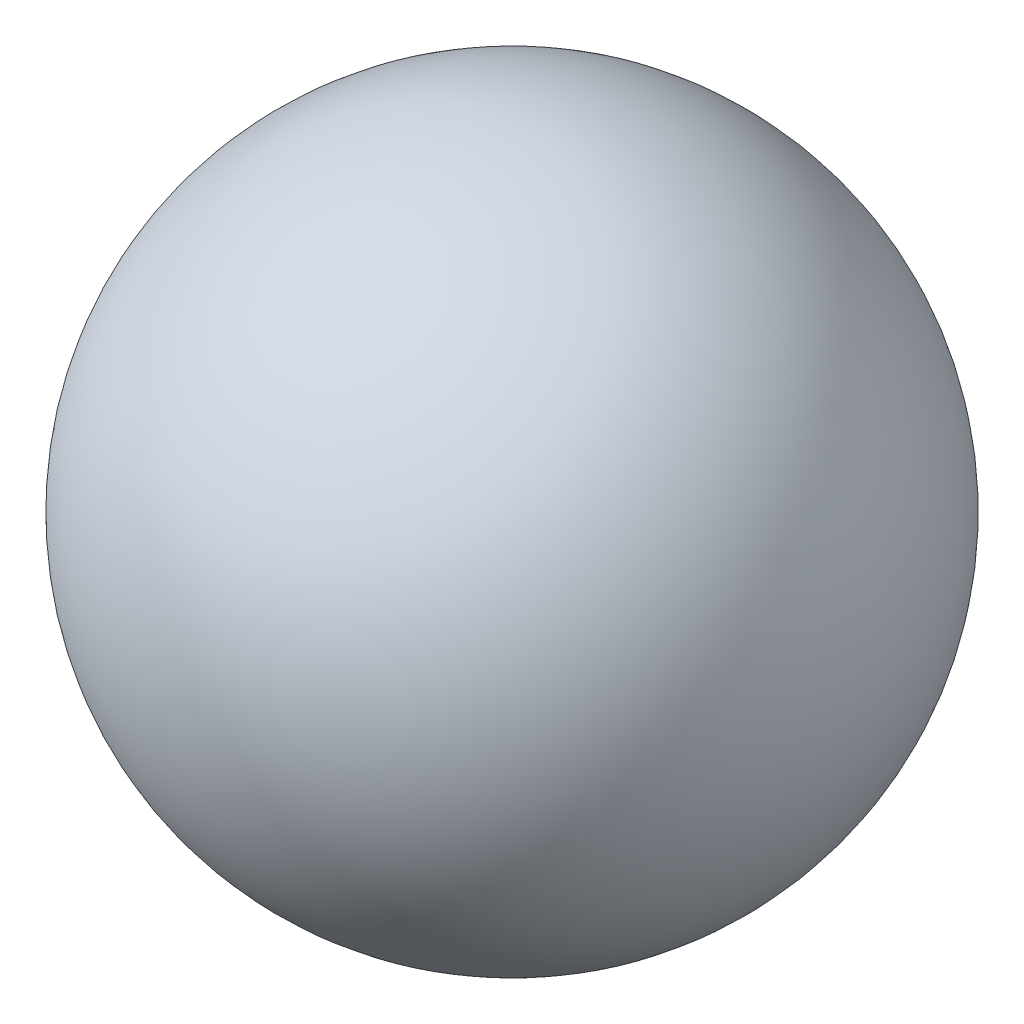
ISO-10303-21;
HEADER;
FILE_DESCRIPTION(('STEP AP214'),'2;1');
FILE_NAME('part.step','',(''),(''),'','','');
FILE_SCHEMA(('AUTOMOTIVE_DESIGN { 1 0 10303 214 1 1 1 1 }'));
ENDSEC;
DATA;
#1=APPLICATION_CONTEXT('core data for automotive mechanical design processes');
#2=APPLICATION_PROTOCOL_DEFINITION('international standard','automotive_design',2000,#1);
#3=PRODUCT_CONTEXT('',#1,'mechanical');
#4=PRODUCT('Part','Part','',(#3));
#5=PRODUCT_RELATED_PRODUCT_CATEGORY('part','',(#4));
#6=PRODUCT_DEFINITION_FORMATION('','',#4);
#7=PRODUCT_DEFINITION_CONTEXT('part definition',#1,'design');
#8=PRODUCT_DEFINITION('design','',#6,#7);
#9=PRODUCT_DEFINITION_SHAPE('','',#8);
#10=(LENGTH_UNIT() NAMED_UNIT(*) SI_UNIT(.MILLI.,.METRE.));
#11=(NAMED_UNIT(*) PLANE_ANGLE_UNIT() SI_UNIT($,.RADIAN.));
#12=(NAMED_UNIT(*) SI_UNIT($,.STERADIAN.) SOLID_ANGLE_UNIT());
#13=UNCERTAINTY_MEASURE_WITH_UNIT(LENGTH_MEASURE(1.E-05),#10,'distance_accuracy_value','');
#14=(GEOMETRIC_REPRESENTATION_CONTEXT(3) GLOBAL_UNCERTAINTY_ASSIGNED_CONTEXT((#13)) GLOBAL_UNIT_ASSIGNED_CONTEXT((#10,
#11,#12)) REPRESENTATION_CONTEXT('',''));
#15=CARTESIAN_POINT('',(0.,0.,0.));
#16=DIRECTION('',(0.,0.,1.));
#17=DIRECTION('',(1.,0.,0.));
#18=AXIS2_PLACEMENT_3D('',#15,#16,#17);
#19=CARTESIAN_POINT('',(0.,0.,0.));
#20=DIRECTION('',(0.,1.,0.));
#21=DIRECTION('',(1.,0.,0.));
#22=AXIS2_PLACEMENT_3D('',#19,#20,#21);
#23=SPHERICAL_SURFACE('',#22,2.77);
#24=CARTESIAN_POINT('',(0.,2.77,0.));
#25=VERTEX_POINT('',#24);
#26=VERTEX_LOOP('',#25);
#27=FACE_BOUND('',#26,.T.);
#28=ADVANCED_FACE('F29',(#27),#23,.T.);
#29=CLOSED_SHELL('',(#28));
#30=MANIFOLD_SOLID_BREP('B2',#29);
#31=ADVANCED_BREP_SHAPE_REPRESENTATION('',(#18,#30),#14);
#32=SHAPE_DEFINITION_REPRESENTATION(#9,#31);
ENDSEC;
END-ISO-10303-21;
